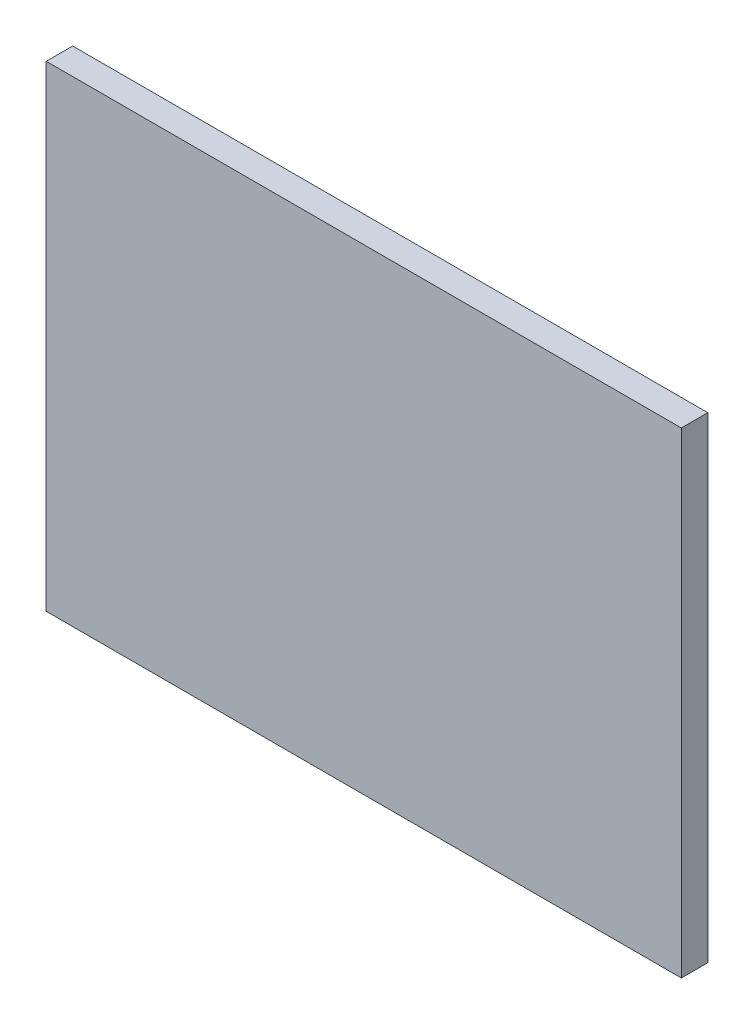
ISO-10303-21;
HEADER;
FILE_DESCRIPTION(('STEP AP214'),'2;1');
FILE_NAME('part.step','',(''),(''),'','','');
FILE_SCHEMA(('AUTOMOTIVE_DESIGN { 1 0 10303 214 1 1 1 1 }'));
ENDSEC;
DATA;
#1=APPLICATION_CONTEXT('core data for automotive mechanical design processes');
#2=APPLICATION_PROTOCOL_DEFINITION('international standard','automotive_design',2000,#1);
#3=PRODUCT_CONTEXT('',#1,'mechanical');
#4=PRODUCT('Part','Part','',(#3));
#5=PRODUCT_RELATED_PRODUCT_CATEGORY('part','',(#4));
#6=PRODUCT_DEFINITION_FORMATION('','',#4);
#7=PRODUCT_DEFINITION_CONTEXT('part definition',#1,'design');
#8=PRODUCT_DEFINITION('design','',#6,#7);
#9=PRODUCT_DEFINITION_SHAPE('','',#8);
#10=(LENGTH_UNIT() NAMED_UNIT(*) SI_UNIT(.MILLI.,.METRE.));
#11=(NAMED_UNIT(*) PLANE_ANGLE_UNIT() SI_UNIT($,.RADIAN.));
#12=(NAMED_UNIT(*) SI_UNIT($,.STERADIAN.) SOLID_ANGLE_UNIT());
#13=UNCERTAINTY_MEASURE_WITH_UNIT(LENGTH_MEASURE(1.E-05),#10,'distance_accuracy_value','');
#14=(GEOMETRIC_REPRESENTATION_CONTEXT(3) GLOBAL_UNCERTAINTY_ASSIGNED_CONTEXT((#13)) GLOBAL_UNIT_ASSIGNED_CONTEXT((#10,
#11,#12)) REPRESENTATION_CONTEXT('',''));
#15=CARTESIAN_POINT('',(0.,0.,0.));
#16=DIRECTION('',(0.,0.,1.));
#17=DIRECTION('',(1.,0.,0.));
#18=AXIS2_PLACEMENT_3D('',#15,#16,#17);
#19=CARTESIAN_POINT('',(457.2,0.,25.4));
#20=DIRECTION('',(-1.,0.,0.));
#21=DIRECTION('',(0.,0.,1.));
#22=AXIS2_PLACEMENT_3D('',#19,#20,#21);
#23=PLANE('',#22);
#24=DIRECTION('',(0.,1.,0.));
#25=VECTOR('',#24,1.);
#26=CARTESIAN_POINT('',(457.2,0.,0.));
#27=LINE('',#26,#25);
#28=CARTESIAN_POINT('',(457.2,0.,0.));
#29=VERTEX_POINT('',#28);
#30=CARTESIAN_POINT('',(457.2,457.2,0.));
#31=VERTEX_POINT('',#30);
#32=EDGE_CURVE('E96',#29,#31,#27,.T.);
#33=ORIENTED_EDGE('',*,*,#32,.T.);
#34=DIRECTION('',(0.,0.,-1.));
#35=VECTOR('',#34,1.);
#36=CARTESIAN_POINT('',(457.2,457.2,25.4));
#37=LINE('',#36,#35);
#38=CARTESIAN_POINT('',(457.2,457.2,25.4));
#39=VERTEX_POINT('',#38);
#40=EDGE_CURVE('E11',#39,#31,#37,.T.);
#41=ORIENTED_EDGE('',*,*,#40,.F.);
#42=DIRECTION('',(0.,1.,0.));
#43=VECTOR('',#42,1.);
#44=CARTESIAN_POINT('',(457.2,0.,25.4));
#45=LINE('',#44,#43);
#46=CARTESIAN_POINT('',(457.2,0.,25.4));
#47=VERTEX_POINT('',#46);
#48=EDGE_CURVE('E84',#47,#39,#45,.T.);
#49=ORIENTED_EDGE('',*,*,#48,.F.);
#50=DIRECTION('',(0.,0.,-1.));
#51=VECTOR('',#50,1.);
#52=CARTESIAN_POINT('',(457.2,0.,25.4));
#53=LINE('',#52,#51);
#54=EDGE_CURVE('E92',#47,#29,#53,.T.);
#55=ORIENTED_EDGE('',*,*,#54,.T.);
#56=EDGE_LOOP('',(#33,#41,#49,#55));
#57=FACE_BOUND('',#56,.T.);
#58=ADVANCED_FACE('F33',(#57),#23,.F.);
#59=CARTESIAN_POINT('',(457.2,457.2,25.4));
#60=DIRECTION('',(0.,-1.,0.));
#61=DIRECTION('',(0.,0.,-1.));
#62=AXIS2_PLACEMENT_3D('',#59,#60,#61);
#63=PLANE('',#62);
#64=DIRECTION('',(-1.,0.,0.));
#65=VECTOR('',#64,1.);
#66=CARTESIAN_POINT('',(457.2,457.2,0.));
#67=LINE('',#66,#65);
#68=CARTESIAN_POINT('',(-152.4,457.2,0.));
#69=VERTEX_POINT('',#68);
#70=EDGE_CURVE('E88',#31,#69,#67,.T.);
#71=ORIENTED_EDGE('',*,*,#70,.T.);
#72=DIRECTION('',(0.,0.,-1.));
#73=VECTOR('',#72,1.);
#74=CARTESIAN_POINT('',(-152.4,457.2,25.4));
#75=LINE('',#74,#73);
#76=CARTESIAN_POINT('',(-152.4,457.2,25.4));
#77=VERTEX_POINT('',#76);
#78=EDGE_CURVE('E41',#77,#69,#75,.T.);
#79=ORIENTED_EDGE('',*,*,#78,.F.);
#80=DIRECTION('',(-1.,0.,0.));
#81=VECTOR('',#80,1.);
#82=CARTESIAN_POINT('',(457.2,457.2,25.4));
#83=LINE('',#82,#81);
#84=EDGE_CURVE('E79',#39,#77,#83,.T.);
#85=ORIENTED_EDGE('',*,*,#84,.F.);
#86=ORIENTED_EDGE('',*,*,#40,.T.);
#87=EDGE_LOOP('',(#71,#79,#85,#86));
#88=FACE_BOUND('',#87,.T.);
#89=ADVANCED_FACE('F87',(#88),#63,.F.);
#90=CARTESIAN_POINT('',(-152.4,0.,25.4));
#91=DIRECTION('',(1.,0.,0.));
#92=DIRECTION('',(0.,0.,-1.));
#93=AXIS2_PLACEMENT_3D('',#90,#91,#92);
#94=PLANE('',#93);
#95=DIRECTION('',(0.,-1.,0.));
#96=VECTOR('',#95,1.);
#97=CARTESIAN_POINT('',(-152.4,0.,0.));
#98=LINE('',#97,#96);
#99=CARTESIAN_POINT('',(-152.4,0.,0.));
#100=VERTEX_POINT('',#99);
#101=EDGE_CURVE('E66',#69,#100,#98,.T.);
#102=ORIENTED_EDGE('',*,*,#101,.T.);
#103=DIRECTION('',(0.,0.,-1.));
#104=VECTOR('',#103,1.);
#105=CARTESIAN_POINT('',(-152.4,0.,25.4));
#106=LINE('',#105,#104);
#107=CARTESIAN_POINT('',(-152.4,0.,25.4));
#108=VERTEX_POINT('',#107);
#109=EDGE_CURVE('E89',#108,#100,#106,.T.);
#110=ORIENTED_EDGE('',*,*,#109,.F.);
#111=DIRECTION('',(0.,-1.,0.));
#112=VECTOR('',#111,1.);
#113=CARTESIAN_POINT('',(-152.4,0.,25.4));
#114=LINE('',#113,#112);
#115=EDGE_CURVE('E82',#77,#108,#114,.T.);
#116=ORIENTED_EDGE('',*,*,#115,.F.);
#117=ORIENTED_EDGE('',*,*,#78,.T.);
#118=EDGE_LOOP('',(#102,#110,#116,#117));
#119=FACE_BOUND('',#118,.T.);
#120=ADVANCED_FACE('F90',(#119),#94,.F.);
#121=CARTESIAN_POINT('',(457.2,0.,25.4));
#122=DIRECTION('',(0.,1.,0.));
#123=DIRECTION('',(0.,0.,1.));
#124=AXIS2_PLACEMENT_3D('',#121,#122,#123);
#125=PLANE('',#124);
#126=DIRECTION('',(1.,0.,0.));
#127=VECTOR('',#126,1.);
#128=CARTESIAN_POINT('',(457.2,0.,0.));
#129=LINE('',#128,#127);
#130=EDGE_CURVE('E72',#100,#29,#129,.T.);
#131=ORIENTED_EDGE('',*,*,#130,.T.);
#132=ORIENTED_EDGE('',*,*,#54,.F.);
#133=DIRECTION('',(1.,0.,0.));
#134=VECTOR('',#133,1.);
#135=CARTESIAN_POINT('',(457.2,0.,25.4));
#136=LINE('',#135,#134);
#137=EDGE_CURVE('E49',#108,#47,#136,.T.);
#138=ORIENTED_EDGE('',*,*,#137,.F.);
#139=ORIENTED_EDGE('',*,*,#109,.T.);
#140=EDGE_LOOP('',(#131,#132,#138,#139));
#141=FACE_BOUND('',#140,.T.);
#142=ADVANCED_FACE('F103',(#141),#125,.F.);
#143=CARTESIAN_POINT('',(0.,0.,25.4));
#144=DIRECTION('',(0.,0.,1.));
#145=DIRECTION('',(1.,0.,0.));
#146=AXIS2_PLACEMENT_3D('',#143,#144,#145);
#147=PLANE('',#146);
#148=ORIENTED_EDGE('',*,*,#48,.T.);
#149=ORIENTED_EDGE('',*,*,#84,.T.);
#150=ORIENTED_EDGE('',*,*,#115,.T.);
#151=ORIENTED_EDGE('',*,*,#137,.T.);
#152=EDGE_LOOP('',(#148,#149,#150,#151));
#153=FACE_BOUND('',#152,.T.);
#154=ADVANCED_FACE('F80',(#153),#147,.T.);
#155=CARTESIAN_POINT('',(0.,0.,0.));
#156=DIRECTION('',(0.,0.,1.));
#157=DIRECTION('',(1.,0.,0.));
#158=AXIS2_PLACEMENT_3D('',#155,#156,#157);
#159=PLANE('',#158);
#160=ORIENTED_EDGE('',*,*,#32,.F.);
#161=ORIENTED_EDGE('',*,*,#130,.F.);
#162=ORIENTED_EDGE('',*,*,#101,.F.);
#163=ORIENTED_EDGE('',*,*,#70,.F.);
#164=EDGE_LOOP('',(#160,#161,#162,#163));
#165=FACE_BOUND('',#164,.T.);
#166=ADVANCED_FACE('F106',(#165),#159,.F.);
#167=CLOSED_SHELL('',(#58,#89,#120,#142,#154,#166));
#168=MANIFOLD_SOLID_BREP('B2',#167);
#169=ADVANCED_BREP_SHAPE_REPRESENTATION('',(#18,#168),#14);
#170=SHAPE_DEFINITION_REPRESENTATION(#9,#169);
ENDSEC;
END-ISO-10303-21;
